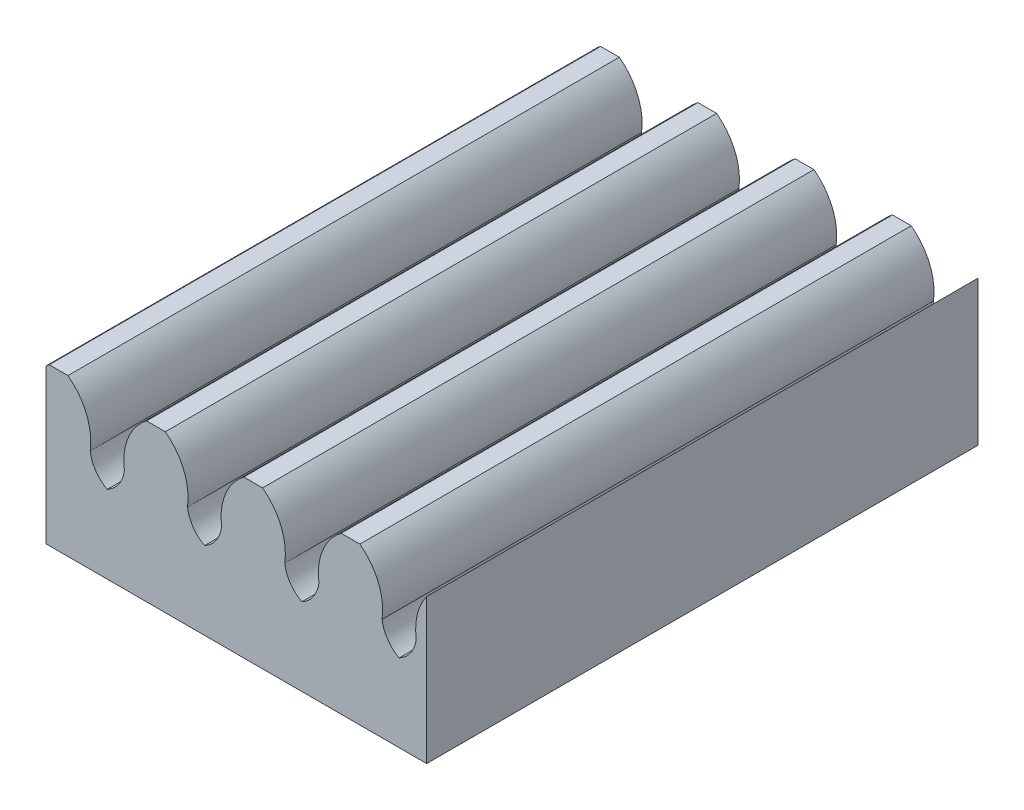
ISO-10303-21;
HEADER;
FILE_DESCRIPTION(('STEP AP214'),'2;1');
FILE_NAME('part.step','',(''),(''),'','','');
FILE_SCHEMA(('AUTOMOTIVE_DESIGN { 1 0 10303 214 1 1 1 1 }'));
ENDSEC;
DATA;
#1=APPLICATION_CONTEXT('core data for automotive mechanical design processes');
#2=APPLICATION_PROTOCOL_DEFINITION('international standard','automotive_design',2000,#1);
#3=PRODUCT_CONTEXT('',#1,'mechanical');
#4=PRODUCT('Part','Part','',(#3));
#5=PRODUCT_RELATED_PRODUCT_CATEGORY('part','',(#4));
#6=PRODUCT_DEFINITION_FORMATION('','',#4);
#7=PRODUCT_DEFINITION_CONTEXT('part definition',#1,'design');
#8=PRODUCT_DEFINITION('design','',#6,#7);
#9=PRODUCT_DEFINITION_SHAPE('','',#8);
#10=(LENGTH_UNIT() NAMED_UNIT(*) SI_UNIT(.MILLI.,.METRE.));
#11=(NAMED_UNIT(*) PLANE_ANGLE_UNIT() SI_UNIT($,.RADIAN.));
#12=(NAMED_UNIT(*) SI_UNIT($,.STERADIAN.) SOLID_ANGLE_UNIT());
#13=UNCERTAINTY_MEASURE_WITH_UNIT(LENGTH_MEASURE(1.E-05),#10,'distance_accuracy_value','');
#14=(GEOMETRIC_REPRESENTATION_CONTEXT(3) GLOBAL_UNCERTAINTY_ASSIGNED_CONTEXT((#13)) GLOBAL_UNIT_ASSIGNED_CONTEXT((#10,
#11,#12)) REPRESENTATION_CONTEXT('',''));
#15=CARTESIAN_POINT('',(0.,0.,0.));
#16=DIRECTION('',(0.,0.,1.));
#17=DIRECTION('',(1.,0.,0.));
#18=AXIS2_PLACEMENT_3D('',#15,#16,#17);
#19=CARTESIAN_POINT('',(-14.2150300106314,7.,25.5));
#20=DIRECTION('',(0.,-1.,0.));
#21=DIRECTION('',(1.,0.,0.));
#22=AXIS2_PLACEMENT_3D('',#19,#20,#21);
#23=PLANE('',#22);
#24=DIRECTION('',(0.,0.,-1.));
#25=VECTOR('',#24,1.);
#26=CARTESIAN_POINT('',(0.302959336614326,7.,26.12));
#27=LINE('',#26,#25);
#28=CARTESIAN_POINT('',(0.302959336614326,7.,0.));
#29=VERTEX_POINT('',#28);
#30=CARTESIAN_POINT('',(0.302959336614325,7.,25.5));
#31=VERTEX_POINT('',#30);
#32=EDGE_CURVE('E324',#29,#31,#27,.F.);
#33=ORIENTED_EDGE('',*,*,#32,.F.);
#34=DIRECTION('',(-1.,0.,0.));
#35=VECTOR('',#34,1.);
#36=CARTESIAN_POINT('',(-14.2150300106314,7.,0.));
#37=LINE('',#36,#35);
#38=CARTESIAN_POINT('',(-0.565530900434776,7.00000000000001,0.));
#39=VERTEX_POINT('',#38);
#40=EDGE_CURVE('E422',#29,#39,#37,.T.);
#41=ORIENTED_EDGE('',*,*,#40,.T.);
#42=DIRECTION('',(0.,0.,-1.));
#43=VECTOR('',#42,1.);
#44=CARTESIAN_POINT('',(-0.565530900434776,7.00000000000001,26.12));
#45=LINE('',#44,#43);
#46=CARTESIAN_POINT('',(-0.565530900434776,7.00000000000001,25.5));
#47=VERTEX_POINT('',#46);
#48=EDGE_CURVE('E291',#47,#39,#45,.T.);
#49=ORIENTED_EDGE('',*,*,#48,.F.);
#50=DIRECTION('',(-1.,0.,0.));
#51=VECTOR('',#50,1.);
#52=CARTESIAN_POINT('',(-14.2150300106314,7.,25.5));
#53=LINE('',#52,#51);
#54=EDGE_CURVE('E405',#31,#47,#53,.T.);
#55=ORIENTED_EDGE('',*,*,#54,.F.);
#56=EDGE_LOOP('',(#33,#41,#49,#55));
#57=FACE_BOUND('',#56,.T.);
#58=ADVANCED_FACE('F39',(#57),#23,.F.);
#59=DIRECTION('',(0.,0.,-1.));
#60=VECTOR('',#59,1.);
#61=CARTESIAN_POINT('',(-4.19704066338567,7.,26.12));
#62=LINE('',#61,#60);
#63=CARTESIAN_POINT('',(-4.19704066338567,7.,0.));
#64=VERTEX_POINT('',#63);
#65=CARTESIAN_POINT('',(-4.19704066338567,7.,25.5));
#66=VERTEX_POINT('',#65);
#67=EDGE_CURVE('E284',#64,#66,#62,.F.);
#68=ORIENTED_EDGE('',*,*,#67,.F.);
#69=CARTESIAN_POINT('',(-5.06553090043478,7.,0.));
#70=VERTEX_POINT('',#69);
#71=EDGE_CURVE('E417',#64,#70,#37,.T.);
#72=ORIENTED_EDGE('',*,*,#71,.T.);
#73=DIRECTION('',(0.,0.,-1.));
#74=VECTOR('',#73,1.);
#75=CARTESIAN_POINT('',(-5.06553090043478,7.,26.12));
#76=LINE('',#75,#74);
#77=CARTESIAN_POINT('',(-5.06553090043478,7.,25.5));
#78=VERTEX_POINT('',#77);
#79=EDGE_CURVE('E385',#78,#70,#76,.T.);
#80=ORIENTED_EDGE('',*,*,#79,.F.);
#81=EDGE_CURVE('E400',#66,#78,#53,.T.);
#82=ORIENTED_EDGE('',*,*,#81,.F.);
#83=EDGE_LOOP('',(#68,#72,#80,#82));
#84=FACE_BOUND('',#83,.T.);
#85=ADVANCED_FACE('F486',(#84),#23,.F.);
#86=DIRECTION('',(0.,0.,-1.));
#87=VECTOR('',#86,1.);
#88=CARTESIAN_POINT('',(-14.0655309004348,7.,26.12));
#89=LINE('',#88,#87);
#90=CARTESIAN_POINT('',(-14.0655309004348,7.,25.5));
#91=VERTEX_POINT('',#90);
#92=CARTESIAN_POINT('',(-14.0655309004348,7.,0.));
#93=VERTEX_POINT('',#92);
#94=EDGE_CURVE('E345',#91,#93,#89,.T.);
#95=ORIENTED_EDGE('',*,*,#94,.F.);
#96=CARTESIAN_POINT('',(-13.1970406633857,7.,25.5));
#97=VERTEX_POINT('',#96);
#98=EDGE_CURVE('E394',#97,#91,#53,.T.);
#99=ORIENTED_EDGE('',*,*,#98,.F.);
#100=DIRECTION('',(0.,0.,-1.));
#101=VECTOR('',#100,1.);
#102=CARTESIAN_POINT('',(-13.1970406633857,7.,26.12));
#103=LINE('',#102,#101);
#104=CARTESIAN_POINT('',(-13.1970406633857,7.,0.));
#105=VERTEX_POINT('',#104);
#106=EDGE_CURVE('E306',#105,#97,#103,.F.);
#107=ORIENTED_EDGE('',*,*,#106,.F.);
#108=EDGE_CURVE('E393',#105,#93,#37,.T.);
#109=ORIENTED_EDGE('',*,*,#108,.T.);
#110=EDGE_LOOP('',(#95,#99,#107,#109));
#111=FACE_BOUND('',#110,.T.);
#112=ADVANCED_FACE('F514',(#111),#23,.F.);
#113=DIRECTION('',(0.,0.,-1.));
#114=VECTOR('',#113,1.);
#115=CARTESIAN_POINT('',(-9.56553090043478,7.,26.12));
#116=LINE('',#115,#114);
#117=CARTESIAN_POINT('',(-9.56553090043478,7.,25.5));
#118=VERTEX_POINT('',#117);
#119=CARTESIAN_POINT('',(-9.56553090043478,7.,0.));
#120=VERTEX_POINT('',#119);
#121=EDGE_CURVE('E213',#118,#120,#116,.T.);
#122=ORIENTED_EDGE('',*,*,#121,.F.);
#123=CARTESIAN_POINT('',(-8.69704066338567,7.,25.5));
#124=VERTEX_POINT('',#123);
#125=EDGE_CURVE('E398',#124,#118,#53,.T.);
#126=ORIENTED_EDGE('',*,*,#125,.F.);
#127=DIRECTION('',(0.,0.,-1.));
#128=VECTOR('',#127,1.);
#129=CARTESIAN_POINT('',(-8.69704066338567,7.,26.12));
#130=LINE('',#129,#128);
#131=CARTESIAN_POINT('',(-8.69704066338567,7.,0.));
#132=VERTEX_POINT('',#131);
#133=EDGE_CURVE('E378',#132,#124,#130,.F.);
#134=ORIENTED_EDGE('',*,*,#133,.F.);
#135=EDGE_CURVE('E416',#132,#120,#37,.T.);
#136=ORIENTED_EDGE('',*,*,#135,.T.);
#137=EDGE_LOOP('',(#122,#126,#134,#136));
#138=FACE_BOUND('',#137,.T.);
#139=ADVANCED_FACE('F462',(#138),#23,.F.);
#140=CARTESIAN_POINT('',(-14.2150300106314,7.,25.5));
#141=DIRECTION('',(1.,0.,0.));
#142=DIRECTION('',(0.,0.,-1.));
#143=AXIS2_PLACEMENT_3D('',#140,#141,#142);
#144=PLANE('',#143);
#145=DIRECTION('',(0.,0.,-1.));
#146=VECTOR('',#145,1.);
#147=CARTESIAN_POINT('',(-14.2150300106314,6.87790534278856,26.12));
#148=LINE('',#147,#146);
#149=CARTESIAN_POINT('',(-14.2150300106314,6.87790534278856,0.));
#150=VERTEX_POINT('',#149);
#151=CARTESIAN_POINT('',(-14.2150300106314,6.87790534278856,25.5));
#152=VERTEX_POINT('',#151);
#153=EDGE_CURVE('E342',#150,#152,#148,.F.);
#154=ORIENTED_EDGE('',*,*,#153,.F.);
#155=DIRECTION('',(0.,-1.,0.));
#156=VECTOR('',#155,1.);
#157=CARTESIAN_POINT('',(-14.2150300106314,7.,0.));
#158=LINE('',#157,#156);
#159=CARTESIAN_POINT('',(-14.2150300106314,-0.249149017037986,0.));
#160=VERTEX_POINT('',#159);
#161=EDGE_CURVE('E418',#150,#160,#158,.T.);
#162=ORIENTED_EDGE('',*,*,#161,.T.);
#163=DIRECTION('',(0.,0.,-1.));
#164=VECTOR('',#163,1.);
#165=CARTESIAN_POINT('',(-14.2150300106314,-0.249149017037986,25.5));
#166=LINE('',#165,#164);
#167=CARTESIAN_POINT('',(-14.2150300106314,-0.249149017037986,25.5));
#168=VERTEX_POINT('',#167);
#169=EDGE_CURVE('E431',#168,#160,#166,.T.);
#170=ORIENTED_EDGE('',*,*,#169,.F.);
#171=DIRECTION('',(0.,-1.,0.));
#172=VECTOR('',#171,1.);
#173=CARTESIAN_POINT('',(-14.2150300106314,7.,25.5));
#174=LINE('',#173,#172);
#175=EDGE_CURVE('E401',#152,#168,#174,.T.);
#176=ORIENTED_EDGE('',*,*,#175,.F.);
#177=EDGE_LOOP('',(#154,#162,#170,#176));
#178=FACE_BOUND('',#177,.T.);
#179=ADVANCED_FACE('F516',(#178),#144,.F.);
#180=CARTESIAN_POINT('',(3.39019241265481,-0.249149017037986,25.5));
#181=DIRECTION('',(-1.,0.,0.));
#182=DIRECTION('',(0.,0.,1.));
#183=AXIS2_PLACEMENT_3D('',#180,#181,#182);
#184=PLANE('',#183);
#185=DIRECTION('',(0.,0.,-1.));
#186=VECTOR('',#185,1.);
#187=CARTESIAN_POINT('',(3.39019241265481,6.44495369087574,26.12));
#188=LINE('',#187,#186);
#189=CARTESIAN_POINT('',(3.39019241265481,6.44495369087574,25.5));
#190=VERTEX_POINT('',#189);
#191=CARTESIAN_POINT('',(3.39019241265481,6.44495369087574,0.));
#192=VERTEX_POINT('',#191);
#193=EDGE_CURVE('E331',#190,#192,#188,.T.);
#194=ORIENTED_EDGE('',*,*,#193,.F.);
#195=DIRECTION('',(0.,1.,0.));
#196=VECTOR('',#195,1.);
#197=CARTESIAN_POINT('',(3.39019241265481,-0.249149017037986,25.5));
#198=LINE('',#197,#196);
#199=CARTESIAN_POINT('',(3.39019241265481,-0.249149017037986,25.5));
#200=VERTEX_POINT('',#199);
#201=EDGE_CURVE('E408',#200,#190,#198,.T.);
#202=ORIENTED_EDGE('',*,*,#201,.F.);
#203=DIRECTION('',(0.,0.,-1.));
#204=VECTOR('',#203,1.);
#205=CARTESIAN_POINT('',(3.39019241265481,-0.249149017037986,25.5));
#206=LINE('',#205,#204);
#207=CARTESIAN_POINT('',(3.39019241265481,-0.249149017037986,0.));
#208=VERTEX_POINT('',#207);
#209=EDGE_CURVE('E412',#200,#208,#206,.T.);
#210=ORIENTED_EDGE('',*,*,#209,.T.);
#211=DIRECTION('',(0.,1.,0.));
#212=VECTOR('',#211,1.);
#213=CARTESIAN_POINT('',(3.39019241265481,-0.249149017037986,0.));
#214=LINE('',#213,#212);
#215=EDGE_CURVE('E399',#208,#192,#214,.T.);
#216=ORIENTED_EDGE('',*,*,#215,.T.);
#217=EDGE_LOOP('',(#194,#202,#210,#216));
#218=FACE_BOUND('',#217,.T.);
#219=ADVANCED_FACE('F521',(#218),#184,.F.);
#220=CARTESIAN_POINT('',(0.939234275176056,-0.249149017037986,25.5));
#221=DIRECTION('',(0.,1.,0.));
#222=DIRECTION('',(0.,0.,1.));
#223=AXIS2_PLACEMENT_3D('',#220,#221,#222);
#224=PLANE('',#223);
#225=DIRECTION('',(1.,0.,0.));
#226=VECTOR('',#225,1.);
#227=CARTESIAN_POINT('',(0.939234275176056,-0.249149017037986,0.));
#228=LINE('',#227,#226);
#229=EDGE_CURVE('E421',#160,#208,#228,.T.);
#230=ORIENTED_EDGE('',*,*,#229,.T.);
#231=ORIENTED_EDGE('',*,*,#209,.F.);
#232=DIRECTION('',(1.,0.,0.));
#233=VECTOR('',#232,1.);
#234=CARTESIAN_POINT('',(-14.2150300106314,-0.249149017037986,25.5));
#235=LINE('',#234,#233);
#236=EDGE_CURVE('E404',#168,#200,#235,.T.);
#237=ORIENTED_EDGE('',*,*,#236,.F.);
#238=ORIENTED_EDGE('',*,*,#169,.T.);
#239=EDGE_LOOP('',(#230,#231,#237,#238));
#240=FACE_BOUND('',#239,.T.);
#241=ADVANCED_FACE('F546',(#240),#224,.F.);
#242=CARTESIAN_POINT('',(0.,0.,25.5));
#243=DIRECTION('',(0.,0.,1.));
#244=DIRECTION('',(1.,0.,0.));
#245=AXIS2_PLACEMENT_3D('',#242,#243,#244);
#246=PLANE('',#245);
#247=ORIENTED_EDGE('',*,*,#98,.T.);
#248=CARTESIAN_POINT('',(-12.4588155948132,4.88007879234123,25.5));
#249=DIRECTION('',(0.,0.,1.));
#250=DIRECTION('',(1.,0.,0.));
#251=AXIS2_PLACEMENT_3D('',#248,#249,#250);
#252=CIRCLE('',#251,2.66);
#253=EDGE_CURVE('E338',#91,#152,#252,.T.);
#254=ORIENTED_EDGE('',*,*,#253,.T.);
#255=ORIENTED_EDGE('',*,*,#175,.T.);
#256=ORIENTED_EDGE('',*,*,#236,.T.);
#257=ORIENTED_EDGE('',*,*,#201,.T.);
#258=CARTESIAN_POINT('',(5.54118440518677,4.88007879234123,25.5));
#259=DIRECTION('',(0.,0.,1.));
#260=DIRECTION('',(1.,0.,0.));
#261=AXIS2_PLACEMENT_3D('',#258,#259,#260);
#262=CIRCLE('',#261,2.66);
#263=CARTESIAN_POINT('',(2.90871421808977,4.49837116332987,25.5));
#264=VERTEX_POINT('',#263);
#265=EDGE_CURVE('E327',#190,#264,#262,.T.);
#266=ORIENTED_EDGE('',*,*,#265,.T.);
#267=CARTESIAN_POINT('',(1.40987932705769,4.68165774064756,25.5));
#268=DIRECTION('',(0.,0.,1.));
#269=DIRECTION('',(1.,0.,0.));
#270=AXIS2_PLACEMENT_3D('',#267,#268,#269);
#271=CIRCLE('',#270,1.51);
#272=CARTESIAN_POINT('',(2.11871421808977,3.34837116332987,25.5));
#273=VERTEX_POINT('',#272);
#274=EDGE_CURVE('E334',#264,#273,#271,.F.);
#275=ORIENTED_EDGE('',*,*,#274,.T.);
#276=CARTESIAN_POINT('',(2.82754910912186,4.68165774064757,25.5));
#277=DIRECTION('',(0.,0.,1.));
#278=DIRECTION('',(1.,0.,0.));
#279=AXIS2_PLACEMENT_3D('',#276,#277,#278);
#280=CIRCLE('',#279,1.51);
#281=CARTESIAN_POINT('',(1.32871421808977,4.49837116332987,25.5));
#282=VERTEX_POINT('',#281);
#283=EDGE_CURVE('E316',#273,#282,#280,.F.);
#284=ORIENTED_EDGE('',*,*,#283,.T.);
#285=CARTESIAN_POINT('',(-1.30375596900723,4.88007879234123,25.5));
#286=DIRECTION('',(0.,0.,1.));
#287=DIRECTION('',(1.,0.,0.));
#288=AXIS2_PLACEMENT_3D('',#285,#286,#287);
#289=CIRCLE('',#288,2.66);
#290=EDGE_CURVE('E320',#282,#31,#289,.T.);
#291=ORIENTED_EDGE('',*,*,#290,.T.);
#292=ORIENTED_EDGE('',*,*,#54,.T.);
#293=CARTESIAN_POINT('',(1.04118440518677,4.88007879234123,25.5));
#294=DIRECTION('',(0.,0.,1.));
#295=DIRECTION('',(1.,0.,0.));
#296=AXIS2_PLACEMENT_3D('',#293,#294,#295);
#297=CIRCLE('',#296,2.66);
#298=CARTESIAN_POINT('',(-1.59128578191023,4.49837116332987,25.5));
#299=VERTEX_POINT('',#298);
#300=EDGE_CURVE('E287',#47,#299,#297,.T.);
#301=ORIENTED_EDGE('',*,*,#300,.T.);
#302=CARTESIAN_POINT('',(-3.09012067294231,4.68165774064756,25.5));
#303=DIRECTION('',(0.,0.,1.));
#304=DIRECTION('',(1.,0.,0.));
#305=AXIS2_PLACEMENT_3D('',#302,#303,#304);
#306=CIRCLE('',#305,1.51);
#307=CARTESIAN_POINT('',(-2.38128578191023,3.34837116332987,25.5));
#308=VERTEX_POINT('',#307);
#309=EDGE_CURVE('E294',#299,#308,#306,.F.);
#310=ORIENTED_EDGE('',*,*,#309,.T.);
#311=CARTESIAN_POINT('',(-1.67245089087814,4.68165774064757,25.5));
#312=DIRECTION('',(0.,0.,1.));
#313=DIRECTION('',(1.,0.,0.));
#314=AXIS2_PLACEMENT_3D('',#311,#312,#313);
#315=CIRCLE('',#314,1.51);
#316=CARTESIAN_POINT('',(-3.17128578191023,4.49837116332987,25.5));
#317=VERTEX_POINT('',#316);
#318=EDGE_CURVE('E276',#308,#317,#315,.F.);
#319=ORIENTED_EDGE('',*,*,#318,.T.);
#320=CARTESIAN_POINT('',(-5.80375596900723,4.88007879234123,25.5));
#321=DIRECTION('',(0.,0.,1.));
#322=DIRECTION('',(1.,0.,0.));
#323=AXIS2_PLACEMENT_3D('',#320,#321,#322);
#324=CIRCLE('',#323,2.66);
#325=EDGE_CURVE('E280',#317,#66,#324,.T.);
#326=ORIENTED_EDGE('',*,*,#325,.T.);
#327=ORIENTED_EDGE('',*,*,#81,.T.);
#328=CARTESIAN_POINT('',(-3.45881559481323,4.88007879234123,25.5));
#329=DIRECTION('',(0.,0.,1.));
#330=DIRECTION('',(1.,0.,0.));
#331=AXIS2_PLACEMENT_3D('',#328,#329,#330);
#332=CIRCLE('',#331,2.66);
#333=CARTESIAN_POINT('',(-6.09128578191023,4.49837116332987,25.5));
#334=VERTEX_POINT('',#333);
#335=EDGE_CURVE('E381',#78,#334,#332,.T.);
#336=ORIENTED_EDGE('',*,*,#335,.T.);
#337=CARTESIAN_POINT('',(-7.59012067294231,4.68165774064756,25.5));
#338=DIRECTION('',(0.,0.,1.));
#339=DIRECTION('',(1.,0.,0.));
#340=AXIS2_PLACEMENT_3D('',#337,#338,#339);
#341=CIRCLE('',#340,1.51);
#342=CARTESIAN_POINT('',(-6.88128578191023,3.34837116332987,25.5));
#343=VERTEX_POINT('',#342);
#344=EDGE_CURVE('E389',#334,#343,#341,.F.);
#345=ORIENTED_EDGE('',*,*,#344,.T.);
#346=CARTESIAN_POINT('',(-6.17245089087814,4.68165774064757,25.5));
#347=DIRECTION('',(0.,0.,1.));
#348=DIRECTION('',(1.,0.,0.));
#349=AXIS2_PLACEMENT_3D('',#346,#347,#348);
#350=CIRCLE('',#349,1.51);
#351=CARTESIAN_POINT('',(-7.67128578191023,4.49837116332987,25.5));
#352=VERTEX_POINT('',#351);
#353=EDGE_CURVE('E370',#343,#352,#350,.F.);
#354=ORIENTED_EDGE('',*,*,#353,.T.);
#355=CARTESIAN_POINT('',(-10.3037559690072,4.88007879234123,25.5));
#356=DIRECTION('',(0.,0.,1.));
#357=DIRECTION('',(1.,0.,0.));
#358=AXIS2_PLACEMENT_3D('',#355,#356,#357);
#359=CIRCLE('',#358,2.66);
#360=EDGE_CURVE('E374',#352,#124,#359,.T.);
#361=ORIENTED_EDGE('',*,*,#360,.T.);
#362=ORIENTED_EDGE('',*,*,#125,.T.);
#363=CARTESIAN_POINT('',(-7.95881559481322,4.88007879234123,25.5));
#364=DIRECTION('',(0.,0.,1.));
#365=DIRECTION('',(1.,0.,0.));
#366=AXIS2_PLACEMENT_3D('',#363,#364,#365);
#367=CIRCLE('',#366,2.66);
#368=CARTESIAN_POINT('',(-10.5912857819102,4.49837116332987,25.5));
#369=VERTEX_POINT('',#368);
#370=EDGE_CURVE('E309',#118,#369,#367,.T.);
#371=ORIENTED_EDGE('',*,*,#370,.T.);
#372=CARTESIAN_POINT('',(-12.0901206729423,4.68165774064756,25.5));
#373=DIRECTION('',(0.,0.,1.));
#374=DIRECTION('',(1.,0.,0.));
#375=AXIS2_PLACEMENT_3D('',#372,#373,#374);
#376=CIRCLE('',#375,1.51);
#377=CARTESIAN_POINT('',(-11.3812857819102,3.34837116332987,25.5));
#378=VERTEX_POINT('',#377);
#379=EDGE_CURVE('E203',#369,#378,#376,.F.);
#380=ORIENTED_EDGE('',*,*,#379,.T.);
#381=CARTESIAN_POINT('',(-10.6724508908781,4.68165774064757,25.5));
#382=DIRECTION('',(0.,0.,1.));
#383=DIRECTION('',(1.,0.,0.));
#384=AXIS2_PLACEMENT_3D('',#381,#382,#383);
#385=CIRCLE('',#384,1.51);
#386=CARTESIAN_POINT('',(-12.1712857819102,4.49837116332987,25.5));
#387=VERTEX_POINT('',#386);
#388=EDGE_CURVE('E298',#378,#387,#385,.F.);
#389=ORIENTED_EDGE('',*,*,#388,.T.);
#390=CARTESIAN_POINT('',(-14.8037559690072,4.88007879234123,25.5));
#391=DIRECTION('',(0.,0.,1.));
#392=DIRECTION('',(1.,0.,0.));
#393=AXIS2_PLACEMENT_3D('',#390,#391,#392);
#394=CIRCLE('',#393,2.66);
#395=EDGE_CURVE('E302',#387,#97,#394,.T.);
#396=ORIENTED_EDGE('',*,*,#395,.T.);
#397=EDGE_LOOP('',(#247,#254,#255,#256,#257,#266,#275,#284,#291,#292,#301,#310,#319,#326,#327,
#336,#345,#354,#361,#362,#371,#380,#389,#396));
#398=FACE_BOUND('',#397,.T.);
#399=ADVANCED_FACE('F477',(#398),#246,.T.);
#400=CARTESIAN_POINT('',(0.,0.,0.));
#401=DIRECTION('',(0.,0.,1.));
#402=DIRECTION('',(1.,0.,0.));
#403=AXIS2_PLACEMENT_3D('',#400,#401,#402);
#404=PLANE('',#403);
#405=CARTESIAN_POINT('',(-12.4588155948132,4.88007879234123,0.));
#406=DIRECTION('',(0.,0.,1.));
#407=DIRECTION('',(1.,0.,0.));
#408=AXIS2_PLACEMENT_3D('',#405,#406,#407);
#409=CIRCLE('',#408,2.66);
#410=EDGE_CURVE('E11',#93,#150,#409,.T.);
#411=ORIENTED_EDGE('',*,*,#410,.F.);
#412=ORIENTED_EDGE('',*,*,#108,.F.);
#413=CARTESIAN_POINT('',(-14.8037559690072,4.88007879234123,0.));
#414=DIRECTION('',(0.,0.,1.));
#415=DIRECTION('',(1.,0.,0.));
#416=AXIS2_PLACEMENT_3D('',#413,#414,#415);
#417=CIRCLE('',#416,2.66);
#418=CARTESIAN_POINT('',(-12.1712857819102,4.49837116332987,0.));
#419=VERTEX_POINT('',#418);
#420=EDGE_CURVE('E441',#419,#105,#417,.T.);
#421=ORIENTED_EDGE('',*,*,#420,.F.);
#422=CARTESIAN_POINT('',(-10.6724508908781,4.68165774064757,0.));
#423=DIRECTION('',(0.,0.,1.));
#424=DIRECTION('',(-1.,0.,0.));
#425=AXIS2_PLACEMENT_3D('',#422,#423,#424);
#426=CIRCLE('',#425,1.51);
#427=CARTESIAN_POINT('',(-11.3812857819102,3.34837116332987,0.));
#428=VERTEX_POINT('',#427);
#429=EDGE_CURVE('E218',#419,#428,#426,.T.);
#430=ORIENTED_EDGE('',*,*,#429,.T.);
#431=CARTESIAN_POINT('',(-12.0901206729423,4.68165774064756,0.));
#432=DIRECTION('',(0.,0.,1.));
#433=DIRECTION('',(1.,0.,0.));
#434=AXIS2_PLACEMENT_3D('',#431,#432,#433);
#435=CIRCLE('',#434,1.51);
#436=CARTESIAN_POINT('',(-10.5912857819102,4.49837116332987,0.));
#437=VERTEX_POINT('',#436);
#438=EDGE_CURVE('E62',#428,#437,#435,.T.);
#439=ORIENTED_EDGE('',*,*,#438,.T.);
#440=CARTESIAN_POINT('',(-7.95881559481322,4.88007879234123,0.));
#441=DIRECTION('',(0.,0.,-1.));
#442=DIRECTION('',(-1.,0.,0.));
#443=AXIS2_PLACEMENT_3D('',#440,#441,#442);
#444=CIRCLE('',#443,2.66);
#445=EDGE_CURVE('E210',#437,#120,#444,.T.);
#446=ORIENTED_EDGE('',*,*,#445,.T.);
#447=ORIENTED_EDGE('',*,*,#135,.F.);
#448=CARTESIAN_POINT('',(-10.3037559690072,4.88007879234123,0.));
#449=DIRECTION('',(0.,0.,1.));
#450=DIRECTION('',(1.,0.,0.));
#451=AXIS2_PLACEMENT_3D('',#448,#449,#450);
#452=CIRCLE('',#451,2.66);
#453=CARTESIAN_POINT('',(-7.67128578191023,4.49837116332987,0.));
#454=VERTEX_POINT('',#453);
#455=EDGE_CURVE('E435',#454,#132,#452,.T.);
#456=ORIENTED_EDGE('',*,*,#455,.F.);
#457=CARTESIAN_POINT('',(-6.17245089087814,4.68165774064757,0.));
#458=DIRECTION('',(0.,0.,1.));
#459=DIRECTION('',(-1.,0.,0.));
#460=AXIS2_PLACEMENT_3D('',#457,#458,#459);
#461=CIRCLE('',#460,1.51);
#462=CARTESIAN_POINT('',(-6.88128578191023,3.34837116332987,0.));
#463=VERTEX_POINT('',#462);
#464=EDGE_CURVE('E356',#454,#463,#461,.T.);
#465=ORIENTED_EDGE('',*,*,#464,.T.);
#466=CARTESIAN_POINT('',(-7.59012067294231,4.68165774064756,0.));
#467=DIRECTION('',(0.,0.,1.));
#468=DIRECTION('',(1.,0.,0.));
#469=AXIS2_PLACEMENT_3D('',#466,#467,#468);
#470=CIRCLE('',#469,1.51);
#471=CARTESIAN_POINT('',(-6.09128578191023,4.49837116332987,0.));
#472=VERTEX_POINT('',#471);
#473=EDGE_CURVE('E348',#463,#472,#470,.T.);
#474=ORIENTED_EDGE('',*,*,#473,.T.);
#475=CARTESIAN_POINT('',(-3.45881559481323,4.88007879234123,0.));
#476=DIRECTION('',(0.,0.,-1.));
#477=DIRECTION('',(-1.,0.,0.));
#478=AXIS2_PLACEMENT_3D('',#475,#476,#477);
#479=CIRCLE('',#478,2.66);
#480=EDGE_CURVE('E352',#472,#70,#479,.T.);
#481=ORIENTED_EDGE('',*,*,#480,.T.);
#482=ORIENTED_EDGE('',*,*,#71,.F.);
#483=CARTESIAN_POINT('',(-5.80375596900723,4.88007879234123,0.));
#484=DIRECTION('',(0.,0.,1.));
#485=DIRECTION('',(1.,0.,0.));
#486=AXIS2_PLACEMENT_3D('',#483,#484,#485);
#487=CIRCLE('',#486,2.66);
#488=CARTESIAN_POINT('',(-3.17128578191023,4.49837116332987,0.));
#489=VERTEX_POINT('',#488);
#490=EDGE_CURVE('E438',#489,#64,#487,.T.);
#491=ORIENTED_EDGE('',*,*,#490,.F.);
#492=CARTESIAN_POINT('',(-1.67245089087814,4.68165774064757,0.));
#493=DIRECTION('',(0.,0.,1.));
#494=DIRECTION('',(-1.,0.,0.));
#495=AXIS2_PLACEMENT_3D('',#492,#493,#494);
#496=CIRCLE('',#495,1.51);
#497=CARTESIAN_POINT('',(-2.38128578191023,3.34837116332987,0.));
#498=VERTEX_POINT('',#497);
#499=EDGE_CURVE('E262',#489,#498,#496,.T.);
#500=ORIENTED_EDGE('',*,*,#499,.T.);
#501=CARTESIAN_POINT('',(-3.09012067294231,4.68165774064756,0.));
#502=DIRECTION('',(0.,0.,1.));
#503=DIRECTION('',(1.,0.,0.));
#504=AXIS2_PLACEMENT_3D('',#501,#502,#503);
#505=CIRCLE('',#504,1.51);
#506=CARTESIAN_POINT('',(-1.59128578191023,4.49837116332987,0.));
#507=VERTEX_POINT('',#506);
#508=EDGE_CURVE('E254',#498,#507,#505,.T.);
#509=ORIENTED_EDGE('',*,*,#508,.T.);
#510=CARTESIAN_POINT('',(1.04118440518677,4.88007879234123,0.));
#511=DIRECTION('',(0.,0.,-1.));
#512=DIRECTION('',(-1.,0.,0.));
#513=AXIS2_PLACEMENT_3D('',#510,#511,#512);
#514=CIRCLE('',#513,2.66);
#515=EDGE_CURVE('E258',#507,#39,#514,.T.);
#516=ORIENTED_EDGE('',*,*,#515,.T.);
#517=ORIENTED_EDGE('',*,*,#40,.F.);
#518=CARTESIAN_POINT('',(-1.30375596900723,4.88007879234123,0.));
#519=DIRECTION('',(0.,0.,1.));
#520=DIRECTION('',(1.,0.,0.));
#521=AXIS2_PLACEMENT_3D('',#518,#519,#520);
#522=CIRCLE('',#521,2.66);
#523=CARTESIAN_POINT('',(1.32871421808977,4.49837116332987,0.));
#524=VERTEX_POINT('',#523);
#525=EDGE_CURVE('E47',#524,#29,#522,.T.);
#526=ORIENTED_EDGE('',*,*,#525,.F.);
#527=CARTESIAN_POINT('',(2.82754910912186,4.68165774064757,0.));
#528=DIRECTION('',(0.,0.,1.));
#529=DIRECTION('',(-1.,0.,0.));
#530=AXIS2_PLACEMENT_3D('',#527,#528,#529);
#531=CIRCLE('',#530,1.51);
#532=CARTESIAN_POINT('',(2.11871421808977,3.34837116332987,0.));
#533=VERTEX_POINT('',#532);
#534=EDGE_CURVE('E241',#524,#533,#531,.T.);
#535=ORIENTED_EDGE('',*,*,#534,.T.);
#536=CARTESIAN_POINT('',(1.40987932705769,4.68165774064756,0.));
#537=DIRECTION('',(0.,0.,1.));
#538=DIRECTION('',(1.,0.,0.));
#539=AXIS2_PLACEMENT_3D('',#536,#537,#538);
#540=CIRCLE('',#539,1.51);
#541=CARTESIAN_POINT('',(2.90871421808977,4.49837116332987,0.));
#542=VERTEX_POINT('',#541);
#543=EDGE_CURVE('E54',#533,#542,#540,.T.);
#544=ORIENTED_EDGE('',*,*,#543,.T.);
#545=CARTESIAN_POINT('',(5.54118440518677,4.88007879234123,0.));
#546=DIRECTION('',(0.,0.,-1.));
#547=DIRECTION('',(-1.,0.,0.));
#548=AXIS2_PLACEMENT_3D('',#545,#546,#547);
#549=CIRCLE('',#548,2.66);
#550=EDGE_CURVE('E237',#542,#192,#549,.T.);
#551=ORIENTED_EDGE('',*,*,#550,.T.);
#552=ORIENTED_EDGE('',*,*,#215,.F.);
#553=ORIENTED_EDGE('',*,*,#229,.F.);
#554=ORIENTED_EDGE('',*,*,#161,.F.);
#555=EDGE_LOOP('',(#411,#412,#421,#430,#439,#446,#447,#456,#465,#474,#481,#482,#491,#500,#509,
#516,#517,#526,#535,#544,#551,#552,#553,#554));
#556=FACE_BOUND('',#555,.T.);
#557=ADVANCED_FACE('F222',(#556),#404,.F.);
#558=CARTESIAN_POINT('',(-3.45881559481323,4.88007879234123,26.12));
#559=DIRECTION('',(0.,0.,-1.));
#560=DIRECTION('',(-1.,0.,0.));
#561=AXIS2_PLACEMENT_3D('',#558,#559,#560);
#562=CYLINDRICAL_SURFACE('',#561,2.66);
#563=ORIENTED_EDGE('',*,*,#79,.T.);
#564=ORIENTED_EDGE('',*,*,#480,.F.);
#565=DIRECTION('',(0.,0.,-1.));
#566=VECTOR('',#565,1.);
#567=CARTESIAN_POINT('',(-6.09128578191023,4.49837116332987,26.12));
#568=LINE('',#567,#566);
#569=EDGE_CURVE('E367',#334,#472,#568,.T.);
#570=ORIENTED_EDGE('',*,*,#569,.F.);
#571=ORIENTED_EDGE('',*,*,#335,.F.);
#572=EDGE_LOOP('',(#563,#564,#570,#571));
#573=FACE_BOUND('',#572,.T.);
#574=ADVANCED_FACE('F482',(#573),#562,.T.);
#575=CARTESIAN_POINT('',(-10.3037559690072,4.88007879234123,26.12));
#576=DIRECTION('',(0.,0.,-1.));
#577=DIRECTION('',(-1.,0.,0.));
#578=AXIS2_PLACEMENT_3D('',#575,#576,#577);
#579=CYLINDRICAL_SURFACE('',#578,2.66);
#580=ORIENTED_EDGE('',*,*,#133,.T.);
#581=ORIENTED_EDGE('',*,*,#360,.F.);
#582=DIRECTION('',(0.,0.,-1.));
#583=VECTOR('',#582,1.);
#584=CARTESIAN_POINT('',(-7.67128578191023,4.49837116332987,26.12));
#585=LINE('',#584,#583);
#586=EDGE_CURVE('E364',#352,#454,#585,.T.);
#587=ORIENTED_EDGE('',*,*,#586,.T.);
#588=ORIENTED_EDGE('',*,*,#455,.T.);
#589=EDGE_LOOP('',(#580,#581,#587,#588));
#590=FACE_BOUND('',#589,.T.);
#591=ADVANCED_FACE('F468',(#590),#579,.T.);
#592=CARTESIAN_POINT('',(-7.59012067294231,4.68165774064756,26.12));
#593=DIRECTION('',(0.,0.,-1.));
#594=DIRECTION('',(-1.,0.,0.));
#595=AXIS2_PLACEMENT_3D('',#592,#593,#594);
#596=CYLINDRICAL_SURFACE('',#595,1.51);
#597=ORIENTED_EDGE('',*,*,#569,.T.);
#598=ORIENTED_EDGE('',*,*,#473,.F.);
#599=DIRECTION('',(0.,0.,-1.));
#600=VECTOR('',#599,1.);
#601=CARTESIAN_POINT('',(-6.88128578191023,3.34837116332987,26.12));
#602=LINE('',#601,#600);
#603=EDGE_CURVE('E360',#343,#463,#602,.T.);
#604=ORIENTED_EDGE('',*,*,#603,.F.);
#605=ORIENTED_EDGE('',*,*,#344,.F.);
#606=EDGE_LOOP('',(#597,#598,#604,#605));
#607=FACE_BOUND('',#606,.T.);
#608=ADVANCED_FACE('F474',(#607),#596,.F.);
#609=CARTESIAN_POINT('',(-6.17245089087814,4.68165774064757,26.12));
#610=DIRECTION('',(0.,0.,-1.));
#611=DIRECTION('',(-1.,0.,0.));
#612=AXIS2_PLACEMENT_3D('',#609,#610,#611);
#613=CYLINDRICAL_SURFACE('',#612,1.51);
#614=ORIENTED_EDGE('',*,*,#603,.T.);
#615=ORIENTED_EDGE('',*,*,#464,.F.);
#616=ORIENTED_EDGE('',*,*,#586,.F.);
#617=ORIENTED_EDGE('',*,*,#353,.F.);
#618=EDGE_LOOP('',(#614,#615,#616,#617));
#619=FACE_BOUND('',#618,.T.);
#620=ADVANCED_FACE('F471',(#619),#613,.F.);
#621=CARTESIAN_POINT('',(1.04118440518677,4.88007879234123,26.12));
#622=DIRECTION('',(0.,0.,-1.));
#623=DIRECTION('',(-1.,0.,0.));
#624=AXIS2_PLACEMENT_3D('',#621,#622,#623);
#625=CYLINDRICAL_SURFACE('',#624,2.66);
#626=ORIENTED_EDGE('',*,*,#48,.T.);
#627=ORIENTED_EDGE('',*,*,#515,.F.);
#628=DIRECTION('',(0.,0.,-1.));
#629=VECTOR('',#628,1.);
#630=CARTESIAN_POINT('',(-1.59128578191023,4.49837116332987,26.12));
#631=LINE('',#630,#629);
#632=EDGE_CURVE('E273',#299,#507,#631,.T.);
#633=ORIENTED_EDGE('',*,*,#632,.F.);
#634=ORIENTED_EDGE('',*,*,#300,.F.);
#635=EDGE_LOOP('',(#626,#627,#633,#634));
#636=FACE_BOUND('',#635,.T.);
#637=ADVANCED_FACE('F500',(#636),#625,.T.);
#638=CARTESIAN_POINT('',(-5.80375596900723,4.88007879234123,26.12));
#639=DIRECTION('',(0.,0.,-1.));
#640=DIRECTION('',(-1.,0.,0.));
#641=AXIS2_PLACEMENT_3D('',#638,#639,#640);
#642=CYLINDRICAL_SURFACE('',#641,2.66);
#643=ORIENTED_EDGE('',*,*,#67,.T.);
#644=ORIENTED_EDGE('',*,*,#325,.F.);
#645=DIRECTION('',(0.,0.,-1.));
#646=VECTOR('',#645,1.);
#647=CARTESIAN_POINT('',(-3.17128578191023,4.49837116332987,26.12));
#648=LINE('',#647,#646);
#649=EDGE_CURVE('E270',#317,#489,#648,.T.);
#650=ORIENTED_EDGE('',*,*,#649,.T.);
#651=ORIENTED_EDGE('',*,*,#490,.T.);
#652=EDGE_LOOP('',(#643,#644,#650,#651));
#653=FACE_BOUND('',#652,.T.);
#654=ADVANCED_FACE('F491',(#653),#642,.T.);
#655=CARTESIAN_POINT('',(-3.09012067294231,4.68165774064756,26.12));
#656=DIRECTION('',(0.,0.,-1.));
#657=DIRECTION('',(-1.,0.,0.));
#658=AXIS2_PLACEMENT_3D('',#655,#656,#657);
#659=CYLINDRICAL_SURFACE('',#658,1.51);
#660=ORIENTED_EDGE('',*,*,#632,.T.);
#661=ORIENTED_EDGE('',*,*,#508,.F.);
#662=DIRECTION('',(0.,0.,-1.));
#663=VECTOR('',#662,1.);
#664=CARTESIAN_POINT('',(-2.38128578191023,3.34837116332987,26.12));
#665=LINE('',#664,#663);
#666=EDGE_CURVE('E266',#308,#498,#665,.T.);
#667=ORIENTED_EDGE('',*,*,#666,.F.);
#668=ORIENTED_EDGE('',*,*,#309,.F.);
#669=EDGE_LOOP('',(#660,#661,#667,#668));
#670=FACE_BOUND('',#669,.T.);
#671=ADVANCED_FACE('F497',(#670),#659,.F.);
#672=CARTESIAN_POINT('',(-1.67245089087814,4.68165774064757,26.12));
#673=DIRECTION('',(0.,0.,-1.));
#674=DIRECTION('',(-1.,0.,0.));
#675=AXIS2_PLACEMENT_3D('',#672,#673,#674);
#676=CYLINDRICAL_SURFACE('',#675,1.51);
#677=ORIENTED_EDGE('',*,*,#666,.T.);
#678=ORIENTED_EDGE('',*,*,#499,.F.);
#679=ORIENTED_EDGE('',*,*,#649,.F.);
#680=ORIENTED_EDGE('',*,*,#318,.F.);
#681=EDGE_LOOP('',(#677,#678,#679,#680));
#682=FACE_BOUND('',#681,.T.);
#683=ADVANCED_FACE('F494',(#682),#676,.F.);
#684=CARTESIAN_POINT('',(-7.95881559481322,4.88007879234123,26.12));
#685=DIRECTION('',(0.,0.,-1.));
#686=DIRECTION('',(-1.,0.,0.));
#687=AXIS2_PLACEMENT_3D('',#684,#685,#686);
#688=CYLINDRICAL_SURFACE('',#687,2.66);
#689=ORIENTED_EDGE('',*,*,#121,.T.);
#690=ORIENTED_EDGE('',*,*,#445,.F.);
#691=DIRECTION('',(0.,0.,-1.));
#692=VECTOR('',#691,1.);
#693=CARTESIAN_POINT('',(-10.5912857819102,4.49837116332987,26.12));
#694=LINE('',#693,#692);
#695=EDGE_CURVE('E199',#369,#437,#694,.T.);
#696=ORIENTED_EDGE('',*,*,#695,.F.);
#697=ORIENTED_EDGE('',*,*,#370,.F.);
#698=EDGE_LOOP('',(#689,#690,#696,#697));
#699=FACE_BOUND('',#698,.T.);
#700=ADVANCED_FACE('F211',(#699),#688,.T.);
#701=CARTESIAN_POINT('',(-14.8037559690072,4.88007879234123,26.12));
#702=DIRECTION('',(0.,0.,-1.));
#703=DIRECTION('',(-1.,0.,0.));
#704=AXIS2_PLACEMENT_3D('',#701,#702,#703);
#705=CYLINDRICAL_SURFACE('',#704,2.66);
#706=ORIENTED_EDGE('',*,*,#106,.T.);
#707=ORIENTED_EDGE('',*,*,#395,.F.);
#708=DIRECTION('',(0.,0.,-1.));
#709=VECTOR('',#708,1.);
#710=CARTESIAN_POINT('',(-12.1712857819102,4.49837116332987,26.12));
#711=LINE('',#710,#709);
#712=EDGE_CURVE('E207',#387,#419,#711,.T.);
#713=ORIENTED_EDGE('',*,*,#712,.T.);
#714=ORIENTED_EDGE('',*,*,#420,.T.);
#715=EDGE_LOOP('',(#706,#707,#713,#714));
#716=FACE_BOUND('',#715,.T.);
#717=ADVANCED_FACE('F534',(#716),#705,.T.);
#718=CARTESIAN_POINT('',(-12.0901206729423,4.68165774064756,26.12));
#719=DIRECTION('',(0.,0.,-1.));
#720=DIRECTION('',(-1.,0.,0.));
#721=AXIS2_PLACEMENT_3D('',#718,#719,#720);
#722=CYLINDRICAL_SURFACE('',#721,1.51);
#723=ORIENTED_EDGE('',*,*,#695,.T.);
#724=ORIENTED_EDGE('',*,*,#438,.F.);
#725=DIRECTION('',(0.,0.,-1.));
#726=VECTOR('',#725,1.);
#727=CARTESIAN_POINT('',(-11.3812857819102,3.34837116332987,26.12));
#728=LINE('',#727,#726);
#729=EDGE_CURVE('E230',#378,#428,#728,.T.);
#730=ORIENTED_EDGE('',*,*,#729,.F.);
#731=ORIENTED_EDGE('',*,*,#379,.F.);
#732=EDGE_LOOP('',(#723,#724,#730,#731));
#733=FACE_BOUND('',#732,.T.);
#734=ADVANCED_FACE('F201',(#733),#722,.F.);
#735=CARTESIAN_POINT('',(-10.6724508908781,4.68165774064757,26.12));
#736=DIRECTION('',(0.,0.,-1.));
#737=DIRECTION('',(-1.,0.,0.));
#738=AXIS2_PLACEMENT_3D('',#735,#736,#737);
#739=CYLINDRICAL_SURFACE('',#738,1.51);
#740=ORIENTED_EDGE('',*,*,#729,.T.);
#741=ORIENTED_EDGE('',*,*,#429,.F.);
#742=ORIENTED_EDGE('',*,*,#712,.F.);
#743=ORIENTED_EDGE('',*,*,#388,.F.);
#744=EDGE_LOOP('',(#740,#741,#742,#743));
#745=FACE_BOUND('',#744,.T.);
#746=ADVANCED_FACE('F536',(#745),#739,.F.);
#747=CARTESIAN_POINT('',(5.54118440518677,4.88007879234123,26.12));
#748=DIRECTION('',(0.,0.,-1.));
#749=DIRECTION('',(-1.,0.,0.));
#750=AXIS2_PLACEMENT_3D('',#747,#748,#749);
#751=CYLINDRICAL_SURFACE('',#750,2.66);
#752=ORIENTED_EDGE('',*,*,#193,.T.);
#753=ORIENTED_EDGE('',*,*,#550,.F.);
#754=DIRECTION('',(0.,0.,-1.));
#755=VECTOR('',#754,1.);
#756=CARTESIAN_POINT('',(2.90871421808977,4.49837116332987,26.12));
#757=LINE('',#756,#755);
#758=EDGE_CURVE('E251',#264,#542,#757,.T.);
#759=ORIENTED_EDGE('',*,*,#758,.F.);
#760=ORIENTED_EDGE('',*,*,#265,.F.);
#761=EDGE_LOOP('',(#752,#753,#759,#760));
#762=FACE_BOUND('',#761,.T.);
#763=ADVANCED_FACE('F552',(#762),#751,.T.);
#764=CARTESIAN_POINT('',(-1.30375596900723,4.88007879234123,26.12));
#765=DIRECTION('',(0.,0.,-1.));
#766=DIRECTION('',(-1.,0.,0.));
#767=AXIS2_PLACEMENT_3D('',#764,#765,#766);
#768=CYLINDRICAL_SURFACE('',#767,2.66);
#769=ORIENTED_EDGE('',*,*,#32,.T.);
#770=ORIENTED_EDGE('',*,*,#290,.F.);
#771=DIRECTION('',(0.,0.,-1.));
#772=VECTOR('',#771,1.);
#773=CARTESIAN_POINT('',(1.32871421808977,4.49837116332987,26.12));
#774=LINE('',#773,#772);
#775=EDGE_CURVE('E248',#282,#524,#774,.T.);
#776=ORIENTED_EDGE('',*,*,#775,.T.);
#777=ORIENTED_EDGE('',*,*,#525,.T.);
#778=EDGE_LOOP('',(#769,#770,#776,#777));
#779=FACE_BOUND('',#778,.T.);
#780=ADVANCED_FACE('F447',(#779),#768,.T.);
#781=CARTESIAN_POINT('',(1.40987932705769,4.68165774064756,26.12));
#782=DIRECTION('',(0.,0.,-1.));
#783=DIRECTION('',(-1.,0.,0.));
#784=AXIS2_PLACEMENT_3D('',#781,#782,#783);
#785=CYLINDRICAL_SURFACE('',#784,1.51);
#786=ORIENTED_EDGE('',*,*,#758,.T.);
#787=ORIENTED_EDGE('',*,*,#543,.F.);
#788=DIRECTION('',(0.,0.,-1.));
#789=VECTOR('',#788,1.);
#790=CARTESIAN_POINT('',(2.11871421808977,3.34837116332987,26.12));
#791=LINE('',#790,#789);
#792=EDGE_CURVE('E245',#273,#533,#791,.T.);
#793=ORIENTED_EDGE('',*,*,#792,.F.);
#794=ORIENTED_EDGE('',*,*,#274,.F.);
#795=EDGE_LOOP('',(#786,#787,#793,#794));
#796=FACE_BOUND('',#795,.T.);
#797=ADVANCED_FACE('F556',(#796),#785,.F.);
#798=CARTESIAN_POINT('',(2.82754910912186,4.68165774064757,26.12));
#799=DIRECTION('',(0.,0.,-1.));
#800=DIRECTION('',(-1.,0.,0.));
#801=AXIS2_PLACEMENT_3D('',#798,#799,#800);
#802=CYLINDRICAL_SURFACE('',#801,1.51);
#803=ORIENTED_EDGE('',*,*,#792,.T.);
#804=ORIENTED_EDGE('',*,*,#534,.F.);
#805=ORIENTED_EDGE('',*,*,#775,.F.);
#806=ORIENTED_EDGE('',*,*,#283,.F.);
#807=EDGE_LOOP('',(#803,#804,#805,#806));
#808=FACE_BOUND('',#807,.T.);
#809=ADVANCED_FACE('F555',(#808),#802,.F.);
#810=CARTESIAN_POINT('',(-12.4588155948132,4.88007879234123,26.12));
#811=DIRECTION('',(0.,0.,-1.));
#812=DIRECTION('',(-1.,0.,0.));
#813=AXIS2_PLACEMENT_3D('',#810,#811,#812);
#814=CYLINDRICAL_SURFACE('',#813,2.66);
#815=ORIENTED_EDGE('',*,*,#94,.T.);
#816=ORIENTED_EDGE('',*,*,#410,.T.);
#817=ORIENTED_EDGE('',*,*,#153,.T.);
#818=ORIENTED_EDGE('',*,*,#253,.F.);
#819=EDGE_LOOP('',(#815,#816,#817,#818));
#820=FACE_BOUND('',#819,.T.);
#821=ADVANCED_FACE('F540',(#820),#814,.T.);
#822=CLOSED_SHELL('',(#58,#85,#112,#139,#179,#219,#241,#399,#557,#574,#591,#608,#620,#637,#654,
#671,#683,#700,#717,#734,#746,#763,#780,#797,#809,#821));
#823=MANIFOLD_SOLID_BREP('B2',#822);
#824=ADVANCED_BREP_SHAPE_REPRESENTATION('',(#18,#823),#14);
#825=SHAPE_DEFINITION_REPRESENTATION(#9,#824);
ENDSEC;
END-ISO-10303-21;
